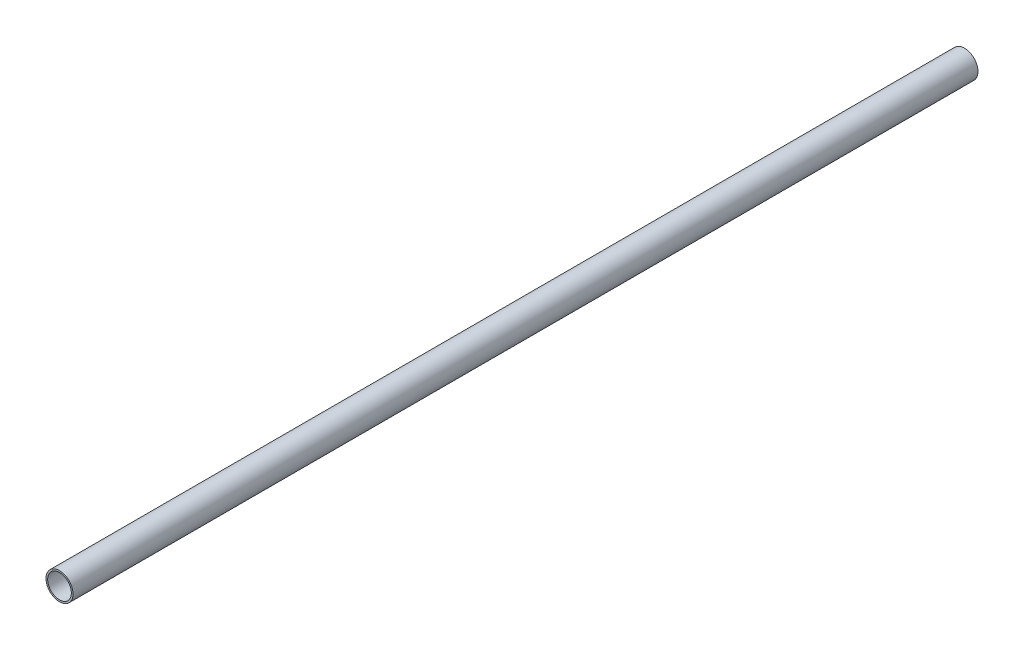
ISO-10303-21;
HEADER;
FILE_DESCRIPTION(('STEP AP214'),'2;1');
FILE_NAME('part.step','',(''),(''),'','','');
FILE_SCHEMA(('AUTOMOTIVE_DESIGN { 1 0 10303 214 1 1 1 1 }'));
ENDSEC;
DATA;
#1=APPLICATION_CONTEXT('core data for automotive mechanical design processes');
#2=APPLICATION_PROTOCOL_DEFINITION('international standard','automotive_design',2000,#1);
#3=PRODUCT_CONTEXT('',#1,'mechanical');
#4=PRODUCT('Part','Part','',(#3));
#5=PRODUCT_RELATED_PRODUCT_CATEGORY('part','',(#4));
#6=PRODUCT_DEFINITION_FORMATION('','',#4);
#7=PRODUCT_DEFINITION_CONTEXT('part definition',#1,'design');
#8=PRODUCT_DEFINITION('design','',#6,#7);
#9=PRODUCT_DEFINITION_SHAPE('','',#8);
#10=(LENGTH_UNIT() NAMED_UNIT(*) SI_UNIT(.MILLI.,.METRE.));
#11=(NAMED_UNIT(*) PLANE_ANGLE_UNIT() SI_UNIT($,.RADIAN.));
#12=(NAMED_UNIT(*) SI_UNIT($,.STERADIAN.) SOLID_ANGLE_UNIT());
#13=UNCERTAINTY_MEASURE_WITH_UNIT(LENGTH_MEASURE(1.E-05),#10,'distance_accuracy_value','');
#14=(GEOMETRIC_REPRESENTATION_CONTEXT(3) GLOBAL_UNCERTAINTY_ASSIGNED_CONTEXT((#13)) GLOBAL_UNIT_ASSIGNED_CONTEXT((#10,
#11,#12)) REPRESENTATION_CONTEXT('',''));
#15=CARTESIAN_POINT('',(0.,0.,0.));
#16=DIRECTION('',(0.,0.,1.));
#17=DIRECTION('',(1.,0.,0.));
#18=AXIS2_PLACEMENT_3D('',#15,#16,#17);
#19=CARTESIAN_POINT('',(0.,0.,535.));
#20=DIRECTION('',(0.,0.,1.));
#21=DIRECTION('',(1.,0.,0.));
#22=AXIS2_PLACEMENT_3D('',#19,#20,#21);
#23=PLANE('',#22);
#24=CARTESIAN_POINT('',(0.,0.,535.));
#25=DIRECTION('',(0.,0.,1.));
#26=DIRECTION('',(1.,0.,0.));
#27=AXIS2_PLACEMENT_3D('',#24,#25,#26);
#28=CIRCLE('',#27,8.);
#29=CARTESIAN_POINT('',(8.,0.,535.));
#30=VERTEX_POINT('',#29);
#31=EDGE_CURVE('E10',#30,#30,#28,.T.);
#32=ORIENTED_EDGE('',*,*,#31,.T.);
#33=EDGE_LOOP('',(#32));
#34=FACE_BOUND('',#33,.T.);
#35=CARTESIAN_POINT('',(0.,0.,535.));
#36=DIRECTION('',(0.,0.,1.));
#37=DIRECTION('',(1.,0.,0.));
#38=AXIS2_PLACEMENT_3D('',#35,#36,#37);
#39=CIRCLE('',#38,7.);
#40=CARTESIAN_POINT('',(7.,0.,535.));
#41=VERTEX_POINT('',#40);
#42=EDGE_CURVE('E43',#41,#41,#39,.T.);
#43=ORIENTED_EDGE('',*,*,#42,.F.);
#44=EDGE_LOOP('',(#43));
#45=FACE_BOUND('',#44,.T.);
#46=ADVANCED_FACE('F32',(#34,#45),#23,.T.);
#47=CARTESIAN_POINT('',(0.,0.,0.));
#48=DIRECTION('',(0.,0.,1.));
#49=DIRECTION('',(1.,0.,0.));
#50=AXIS2_PLACEMENT_3D('',#47,#48,#49);
#51=PLANE('',#50);
#52=CARTESIAN_POINT('',(0.,0.,0.));
#53=DIRECTION('',(0.,0.,1.));
#54=DIRECTION('',(1.,0.,0.));
#55=AXIS2_PLACEMENT_3D('',#52,#53,#54);
#56=CIRCLE('',#55,8.);
#57=CARTESIAN_POINT('',(8.,0.,0.));
#58=VERTEX_POINT('',#57);
#59=EDGE_CURVE('E36',#58,#58,#56,.T.);
#60=ORIENTED_EDGE('',*,*,#59,.F.);
#61=EDGE_LOOP('',(#60));
#62=FACE_BOUND('',#61,.T.);
#63=CARTESIAN_POINT('',(0.,0.,0.));
#64=DIRECTION('',(0.,0.,1.));
#65=DIRECTION('',(1.,0.,0.));
#66=AXIS2_PLACEMENT_3D('',#63,#64,#65);
#67=CIRCLE('',#66,7.);
#68=CARTESIAN_POINT('',(7.,0.,0.));
#69=VERTEX_POINT('',#68);
#70=EDGE_CURVE('E45',#69,#69,#67,.T.);
#71=ORIENTED_EDGE('',*,*,#70,.T.);
#72=EDGE_LOOP('',(#71));
#73=FACE_BOUND('',#72,.T.);
#74=ADVANCED_FACE('F55',(#62,#73),#51,.F.);
#75=CARTESIAN_POINT('',(0.,0.,535.));
#76=DIRECTION('',(0.,0.,-1.));
#77=DIRECTION('',(-1.,0.,0.));
#78=AXIS2_PLACEMENT_3D('',#75,#76,#77);
#79=CYLINDRICAL_SURFACE('',#78,8.);
#80=ORIENTED_EDGE('',*,*,#31,.F.);
#81=EDGE_LOOP('',(#80));
#82=FACE_BOUND('',#81,.T.);
#83=ORIENTED_EDGE('',*,*,#59,.T.);
#84=EDGE_LOOP('',(#83));
#85=FACE_BOUND('',#84,.T.);
#86=ADVANCED_FACE('F34',(#82,#85),#79,.T.);
#87=CARTESIAN_POINT('',(0.,0.,535.));
#88=DIRECTION('',(0.,0.,-1.));
#89=DIRECTION('',(-1.,0.,0.));
#90=AXIS2_PLACEMENT_3D('',#87,#88,#89);
#91=CYLINDRICAL_SURFACE('',#90,7.);
#92=ORIENTED_EDGE('',*,*,#42,.T.);
#93=EDGE_LOOP('',(#92));
#94=FACE_BOUND('',#93,.T.);
#95=ORIENTED_EDGE('',*,*,#70,.F.);
#96=EDGE_LOOP('',(#95));
#97=FACE_BOUND('',#96,.T.);
#98=ADVANCED_FACE('F51',(#94,#97),#91,.F.);
#99=CLOSED_SHELL('',(#46,#74,#86,#98));
#100=MANIFOLD_SOLID_BREP('B2',#99);
#101=ADVANCED_BREP_SHAPE_REPRESENTATION('',(#18,#100),#14);
#102=SHAPE_DEFINITION_REPRESENTATION(#9,#101);
ENDSEC;
END-ISO-10303-21;
